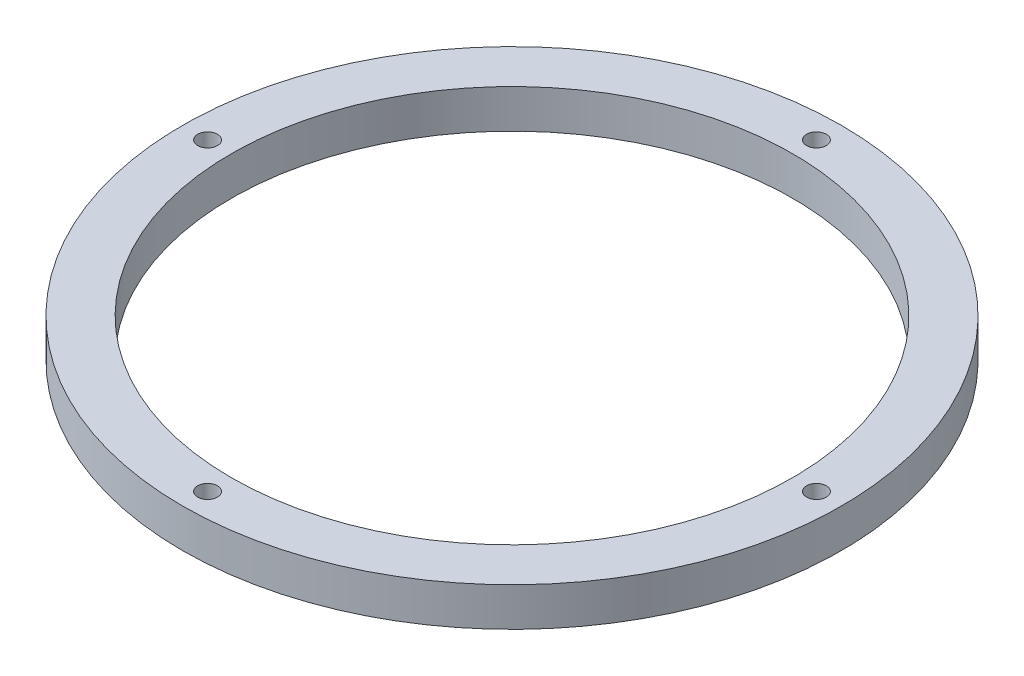
ISO-10303-21;
HEADER;
FILE_DESCRIPTION(('STEP AP214'),'2;1');
FILE_NAME('part.step','',(''),(''),'','','');
FILE_SCHEMA(('AUTOMOTIVE_DESIGN { 1 0 10303 214 1 1 1 1 }'));
ENDSEC;
DATA;
#1=APPLICATION_CONTEXT('core data for automotive mechanical design processes');
#2=APPLICATION_PROTOCOL_DEFINITION('international standard','automotive_design',2000,#1);
#3=PRODUCT_CONTEXT('',#1,'mechanical');
#4=PRODUCT('Part','Part','',(#3));
#5=PRODUCT_RELATED_PRODUCT_CATEGORY('part','',(#4));
#6=PRODUCT_DEFINITION_FORMATION('','',#4);
#7=PRODUCT_DEFINITION_CONTEXT('part definition',#1,'design');
#8=PRODUCT_DEFINITION('design','',#6,#7);
#9=PRODUCT_DEFINITION_SHAPE('','',#8);
#10=(LENGTH_UNIT() NAMED_UNIT(*) SI_UNIT(.MILLI.,.METRE.));
#11=(NAMED_UNIT(*) PLANE_ANGLE_UNIT() SI_UNIT($,.RADIAN.));
#12=(NAMED_UNIT(*) SI_UNIT($,.STERADIAN.) SOLID_ANGLE_UNIT());
#13=UNCERTAINTY_MEASURE_WITH_UNIT(LENGTH_MEASURE(1.E-05),#10,'distance_accuracy_value','');
#14=(GEOMETRIC_REPRESENTATION_CONTEXT(3) GLOBAL_UNCERTAINTY_ASSIGNED_CONTEXT((#13)) GLOBAL_UNIT_ASSIGNED_CONTEXT((#10,
#11,#12)) REPRESENTATION_CONTEXT('',''));
#15=CARTESIAN_POINT('',(0.,0.,0.));
#16=DIRECTION('',(0.,0.,1.));
#17=DIRECTION('',(1.,0.,0.));
#18=AXIS2_PLACEMENT_3D('',#15,#16,#17);
#19=CARTESIAN_POINT('',(0.,-5.000000033,0.));
#20=DIRECTION('',(0.,1.,0.));
#21=DIRECTION('',(0.,0.,1.));
#22=AXIS2_PLACEMENT_3D('',#19,#20,#21);
#23=PLANE('',#22);
#24=CARTESIAN_POINT('',(78.74999998,-5.000000033,0.));
#25=DIRECTION('',(0.,-1.,0.));
#26=DIRECTION('',(0.,0.,-1.));
#27=AXIS2_PLACEMENT_3D('',#24,#25,#26);
#28=CIRCLE('',#27,4.88950000000001);
#29=CARTESIAN_POINT('',(78.74999998,-5.000000033,-4.88950000000001));
#30=VERTEX_POINT('',#29);
#31=EDGE_CURVE('E81',#30,#30,#28,.T.);
#32=ORIENTED_EDGE('',*,*,#31,.F.);
#33=EDGE_LOOP('',(#32));
#34=FACE_BOUND('',#33,.T.);
#35=CARTESIAN_POINT('',(2.74954155364067E-13,-5.000000033,-78.74999998));
#36=DIRECTION('',(0.,-1.,0.));
#37=DIRECTION('',(0.,0.,-1.));
#38=AXIS2_PLACEMENT_3D('',#35,#36,#37);
#39=CIRCLE('',#38,4.8895);
#40=CARTESIAN_POINT('',(2.74954155364067E-13,-5.000000033,-83.63949998));
#41=VERTEX_POINT('',#40);
#42=EDGE_CURVE('E72',#41,#41,#39,.T.);
#43=ORIENTED_EDGE('',*,*,#42,.F.);
#44=EDGE_LOOP('',(#43));
#45=FACE_BOUND('',#44,.T.);
#46=CARTESIAN_POINT('',(-78.74999998,-5.000000033,0.));
#47=DIRECTION('',(0.,-1.,0.));
#48=DIRECTION('',(0.,0.,-1.));
#49=AXIS2_PLACEMENT_3D('',#46,#47,#48);
#50=CIRCLE('',#49,4.88950000000001);
#51=CARTESIAN_POINT('',(-78.74999998,-5.000000033,-4.88950000000001));
#52=VERTEX_POINT('',#51);
#53=EDGE_CURVE('E63',#52,#52,#50,.T.);
#54=ORIENTED_EDGE('',*,*,#53,.F.);
#55=EDGE_LOOP('',(#54));
#56=FACE_BOUND('',#55,.T.);
#57=CARTESIAN_POINT('',(0.,-5.000000033,0.));
#58=DIRECTION('',(0.,1.,0.));
#59=DIRECTION('',(0.,0.,1.));
#60=AXIS2_PLACEMENT_3D('',#57,#58,#59);
#61=CIRCLE('',#60,72.599999961);
#62=CARTESIAN_POINT('',(0.,-5.000000033,72.599999961));
#63=VERTEX_POINT('',#62);
#64=EDGE_CURVE('E43',#63,#63,#61,.T.);
#65=ORIENTED_EDGE('',*,*,#64,.T.);
#66=EDGE_LOOP('',(#65));
#67=FACE_BOUND('',#66,.T.);
#68=CARTESIAN_POINT('',(0.,-5.000000033,0.));
#69=DIRECTION('',(0.,1.,0.));
#70=DIRECTION('',(0.,0.,1.));
#71=AXIS2_PLACEMENT_3D('',#68,#69,#70);
#72=CIRCLE('',#71,85.250000061);
#73=CARTESIAN_POINT('',(0.,-5.000000033,85.250000061));
#74=VERTEX_POINT('',#73);
#75=EDGE_CURVE('E34',#74,#74,#72,.T.);
#76=ORIENTED_EDGE('',*,*,#75,.F.);
#77=EDGE_LOOP('',(#76));
#78=FACE_BOUND('',#77,.T.);
#79=CARTESIAN_POINT('',(-8.24862466092201E-13,-5.000000033,78.74999998));
#80=DIRECTION('',(0.,-1.,0.));
#81=DIRECTION('',(0.,0.,-1.));
#82=AXIS2_PLACEMENT_3D('',#79,#80,#81);
#83=CIRCLE('',#82,4.8895);
#84=CARTESIAN_POINT('',(-8.24862466092201E-13,-5.000000033,73.86049998));
#85=VERTEX_POINT('',#84);
#86=EDGE_CURVE('E54',#85,#85,#83,.T.);
#87=ORIENTED_EDGE('',*,*,#86,.F.);
#88=EDGE_LOOP('',(#87));
#89=FACE_BOUND('',#88,.T.);
#90=ADVANCED_FACE('F30',(#34,#45,#56,#67,#78,#89),#23,.F.);
#91=CARTESIAN_POINT('',(0.,5.000000033,0.));
#92=DIRECTION('',(0.,1.,0.));
#93=DIRECTION('',(0.,0.,1.));
#94=AXIS2_PLACEMENT_3D('',#91,#92,#93);
#95=PLANE('',#94);
#96=CARTESIAN_POINT('',(78.74999998,5.000000033,0.));
#97=DIRECTION('',(0.,-1.,0.));
#98=DIRECTION('',(0.,0.,-1.));
#99=AXIS2_PLACEMENT_3D('',#96,#97,#98);
#100=CIRCLE('',#99,2.55270000000001);
#101=CARTESIAN_POINT('',(78.74999998,5.000000033,-2.55270000000001));
#102=VERTEX_POINT('',#101);
#103=EDGE_CURVE('E75',#102,#102,#100,.T.);
#104=ORIENTED_EDGE('',*,*,#103,.T.);
#105=EDGE_LOOP('',(#104));
#106=FACE_BOUND('',#105,.T.);
#107=CARTESIAN_POINT('',(2.74954155364067E-13,5.000000033,-78.74999998));
#108=DIRECTION('',(0.,-1.,0.));
#109=DIRECTION('',(0.,0.,-1.));
#110=AXIS2_PLACEMENT_3D('',#107,#108,#109);
#111=CIRCLE('',#110,2.5527);
#112=CARTESIAN_POINT('',(2.74954155364067E-13,5.000000033,-81.30269998));
#113=VERTEX_POINT('',#112);
#114=EDGE_CURVE('E66',#113,#113,#111,.T.);
#115=ORIENTED_EDGE('',*,*,#114,.T.);
#116=EDGE_LOOP('',(#115));
#117=FACE_BOUND('',#116,.T.);
#118=CARTESIAN_POINT('',(-78.74999998,5.000000033,0.));
#119=DIRECTION('',(0.,-1.,0.));
#120=DIRECTION('',(0.,0.,-1.));
#121=AXIS2_PLACEMENT_3D('',#118,#119,#120);
#122=CIRCLE('',#121,2.55270000000001);
#123=CARTESIAN_POINT('',(-78.74999998,5.000000033,-2.55270000000001));
#124=VERTEX_POINT('',#123);
#125=EDGE_CURVE('E57',#124,#124,#122,.T.);
#126=ORIENTED_EDGE('',*,*,#125,.T.);
#127=EDGE_LOOP('',(#126));
#128=FACE_BOUND('',#127,.T.);
#129=CARTESIAN_POINT('',(-8.24862466092201E-13,5.000000033,78.74999998));
#130=DIRECTION('',(0.,-1.,0.));
#131=DIRECTION('',(0.,0.,-1.));
#132=AXIS2_PLACEMENT_3D('',#129,#130,#131);
#133=CIRCLE('',#132,2.5527);
#134=CARTESIAN_POINT('',(-8.24862466092201E-13,5.000000033,76.19729998));
#135=VERTEX_POINT('',#134);
#136=EDGE_CURVE('E46',#135,#135,#133,.T.);
#137=ORIENTED_EDGE('',*,*,#136,.T.);
#138=EDGE_LOOP('',(#137));
#139=FACE_BOUND('',#138,.T.);
#140=CARTESIAN_POINT('',(0.,5.000000033,0.));
#141=DIRECTION('',(0.,1.,0.));
#142=DIRECTION('',(0.,0.,1.));
#143=AXIS2_PLACEMENT_3D('',#140,#141,#142);
#144=CIRCLE('',#143,85.250000061);
#145=CARTESIAN_POINT('',(0.,5.000000033,85.250000061));
#146=VERTEX_POINT('',#145);
#147=EDGE_CURVE('E10',#146,#146,#144,.T.);
#148=ORIENTED_EDGE('',*,*,#147,.T.);
#149=EDGE_LOOP('',(#148));
#150=FACE_BOUND('',#149,.T.);
#151=CARTESIAN_POINT('',(0.,5.000000033,0.));
#152=DIRECTION('',(0.,1.,0.));
#153=DIRECTION('',(0.,0.,1.));
#154=AXIS2_PLACEMENT_3D('',#151,#152,#153);
#155=CIRCLE('',#154,72.599999961);
#156=CARTESIAN_POINT('',(0.,5.000000033,72.599999961));
#157=VERTEX_POINT('',#156);
#158=EDGE_CURVE('E41',#157,#157,#155,.T.);
#159=ORIENTED_EDGE('',*,*,#158,.F.);
#160=EDGE_LOOP('',(#159));
#161=FACE_BOUND('',#160,.T.);
#162=ADVANCED_FACE('F89',(#106,#117,#128,#139,#150,#161),#95,.T.);
#163=CARTESIAN_POINT('',(0.,5.000000033,0.));
#164=DIRECTION('',(0.,-1.,0.));
#165=DIRECTION('',(0.,0.,-1.));
#166=AXIS2_PLACEMENT_3D('',#163,#164,#165);
#167=CYLINDRICAL_SURFACE('',#166,85.250000061);
#168=ORIENTED_EDGE('',*,*,#147,.F.);
#169=EDGE_LOOP('',(#168));
#170=FACE_BOUND('',#169,.T.);
#171=ORIENTED_EDGE('',*,*,#75,.T.);
#172=EDGE_LOOP('',(#171));
#173=FACE_BOUND('',#172,.T.);
#174=ADVANCED_FACE('F32',(#170,#173),#167,.T.);
#175=CARTESIAN_POINT('',(0.,5.000000033,0.));
#176=DIRECTION('',(0.,-1.,0.));
#177=DIRECTION('',(0.,0.,-1.));
#178=AXIS2_PLACEMENT_3D('',#175,#176,#177);
#179=CYLINDRICAL_SURFACE('',#178,72.599999961);
#180=ORIENTED_EDGE('',*,*,#158,.T.);
#181=EDGE_LOOP('',(#180));
#182=FACE_BOUND('',#181,.T.);
#183=ORIENTED_EDGE('',*,*,#64,.F.);
#184=EDGE_LOOP('',(#183));
#185=FACE_BOUND('',#184,.T.);
#186=ADVANCED_FACE('F113',(#182,#185),#179,.F.);
#187=CARTESIAN_POINT('',(-8.24862466092201E-13,-5.000000033,78.74999998));
#188=DIRECTION('',(0.,-1.,0.));
#189=DIRECTION('',(0.,0.,-1.));
#190=AXIS2_PLACEMENT_3D('',#187,#188,#189);
#191=CYLINDRICAL_SURFACE('',#190,2.5527);
#192=ORIENTED_EDGE('',*,*,#136,.F.);
#193=EDGE_LOOP('',(#192));
#194=FACE_BOUND('',#193,.T.);
#195=CARTESIAN_POINT('',(-8.24862466092201E-13,-3.03919201486493,78.74999998));
#196=DIRECTION('',(0.,-1.,0.));
#197=DIRECTION('',(0.,0.,-1.));
#198=AXIS2_PLACEMENT_3D('',#195,#196,#197);
#199=CIRCLE('',#198,2.5527);
#200=CARTESIAN_POINT('',(-8.24862466092201E-13,-3.03919201486493,76.19729998));
#201=VERTEX_POINT('',#200);
#202=EDGE_CURVE('E51',#201,#201,#199,.T.);
#203=ORIENTED_EDGE('',*,*,#202,.T.);
#204=EDGE_LOOP('',(#203));
#205=FACE_BOUND('',#204,.T.);
#206=ADVANCED_FACE('F103',(#194,#205),#191,.F.);
#207=CARTESIAN_POINT('',(-8.24862466092201E-13,-5.000000033,78.74999998));
#208=DIRECTION('',(0.,-1.,0.));
#209=DIRECTION('',(0.,0.,-1.));
#210=AXIS2_PLACEMENT_3D('',#207,#208,#209);
#211=CONICAL_SURFACE('',#210,4.8895,0.872664625997164);
#212=ORIENTED_EDGE('',*,*,#202,.F.);
#213=EDGE_LOOP('',(#212));
#214=FACE_BOUND('',#213,.T.);
#215=ORIENTED_EDGE('',*,*,#86,.T.);
#216=EDGE_LOOP('',(#215));
#217=FACE_BOUND('',#216,.T.);
#218=ADVANCED_FACE('F100',(#214,#217),#211,.F.);
#219=CARTESIAN_POINT('',(-78.74999998,-5.000000033,0.));
#220=DIRECTION('',(0.,-1.,0.));
#221=DIRECTION('',(0.,0.,-1.));
#222=AXIS2_PLACEMENT_3D('',#219,#220,#221);
#223=CYLINDRICAL_SURFACE('',#222,2.55270000000001);
#224=ORIENTED_EDGE('',*,*,#125,.F.);
#225=EDGE_LOOP('',(#224));
#226=FACE_BOUND('',#225,.T.);
#227=CARTESIAN_POINT('',(-78.74999998,-3.03919201486493,0.));
#228=DIRECTION('',(0.,-1.,0.));
#229=DIRECTION('',(0.,0.,-1.));
#230=AXIS2_PLACEMENT_3D('',#227,#228,#229);
#231=CIRCLE('',#230,2.55270000000001);
#232=CARTESIAN_POINT('',(-78.74999998,-3.03919201486493,-2.55270000000001));
#233=VERTEX_POINT('',#232);
#234=EDGE_CURVE('E60',#233,#233,#231,.T.);
#235=ORIENTED_EDGE('',*,*,#234,.T.);
#236=EDGE_LOOP('',(#235));
#237=FACE_BOUND('',#236,.T.);
#238=ADVANCED_FACE('F102',(#226,#237),#223,.F.);
#239=CARTESIAN_POINT('',(-78.74999998,-5.000000033,0.));
#240=DIRECTION('',(0.,-1.,0.));
#241=DIRECTION('',(0.,0.,-1.));
#242=AXIS2_PLACEMENT_3D('',#239,#240,#241);
#243=CONICAL_SURFACE('',#242,4.88950000000001,0.872664625997164);
#244=ORIENTED_EDGE('',*,*,#234,.F.);
#245=EDGE_LOOP('',(#244));
#246=FACE_BOUND('',#245,.T.);
#247=ORIENTED_EDGE('',*,*,#53,.T.);
#248=EDGE_LOOP('',(#247));
#249=FACE_BOUND('',#248,.T.);
#250=ADVANCED_FACE('F110',(#246,#249),#243,.F.);
#251=CARTESIAN_POINT('',(2.74954155364067E-13,-5.000000033,-78.74999998));
#252=DIRECTION('',(0.,-1.,0.));
#253=DIRECTION('',(0.,0.,-1.));
#254=AXIS2_PLACEMENT_3D('',#251,#252,#253);
#255=CYLINDRICAL_SURFACE('',#254,2.5527);
#256=ORIENTED_EDGE('',*,*,#114,.F.);
#257=EDGE_LOOP('',(#256));
#258=FACE_BOUND('',#257,.T.);
#259=CARTESIAN_POINT('',(2.74954155364067E-13,-3.03919201486493,-78.74999998));
#260=DIRECTION('',(0.,-1.,0.));
#261=DIRECTION('',(0.,0.,-1.));
#262=AXIS2_PLACEMENT_3D('',#259,#260,#261);
#263=CIRCLE('',#262,2.5527);
#264=CARTESIAN_POINT('',(2.74954155364067E-13,-3.03919201486493,-81.30269998));
#265=VERTEX_POINT('',#264);
#266=EDGE_CURVE('E69',#265,#265,#263,.T.);
#267=ORIENTED_EDGE('',*,*,#266,.T.);
#268=EDGE_LOOP('',(#267));
#269=FACE_BOUND('',#268,.T.);
#270=ADVANCED_FACE('F144',(#258,#269),#255,.F.);
#271=CARTESIAN_POINT('',(2.74954155364067E-13,-5.000000033,-78.74999998));
#272=DIRECTION('',(0.,-1.,0.));
#273=DIRECTION('',(0.,0.,-1.));
#274=AXIS2_PLACEMENT_3D('',#271,#272,#273);
#275=CONICAL_SURFACE('',#274,4.8895,0.872664625997164);
#276=ORIENTED_EDGE('',*,*,#266,.F.);
#277=EDGE_LOOP('',(#276));
#278=FACE_BOUND('',#277,.T.);
#279=ORIENTED_EDGE('',*,*,#42,.T.);
#280=EDGE_LOOP('',(#279));
#281=FACE_BOUND('',#280,.T.);
#282=ADVANCED_FACE('F148',(#278,#281),#275,.F.);
#283=CARTESIAN_POINT('',(78.74999998,-5.000000033,0.));
#284=DIRECTION('',(0.,-1.,0.));
#285=DIRECTION('',(0.,0.,-1.));
#286=AXIS2_PLACEMENT_3D('',#283,#284,#285);
#287=CYLINDRICAL_SURFACE('',#286,2.55270000000001);
#288=ORIENTED_EDGE('',*,*,#103,.F.);
#289=EDGE_LOOP('',(#288));
#290=FACE_BOUND('',#289,.T.);
#291=CARTESIAN_POINT('',(78.74999998,-3.03919201486493,0.));
#292=DIRECTION('',(0.,-1.,0.));
#293=DIRECTION('',(0.,0.,-1.));
#294=AXIS2_PLACEMENT_3D('',#291,#292,#293);
#295=CIRCLE('',#294,2.55270000000001);
#296=CARTESIAN_POINT('',(78.74999998,-3.03919201486493,-2.55270000000001));
#297=VERTEX_POINT('',#296);
#298=EDGE_CURVE('E78',#297,#297,#295,.T.);
#299=ORIENTED_EDGE('',*,*,#298,.T.);
#300=EDGE_LOOP('',(#299));
#301=FACE_BOUND('',#300,.T.);
#302=ADVANCED_FACE('F154',(#290,#301),#287,.F.);
#303=CARTESIAN_POINT('',(78.74999998,-5.000000033,0.));
#304=DIRECTION('',(0.,-1.,0.));
#305=DIRECTION('',(0.,0.,-1.));
#306=AXIS2_PLACEMENT_3D('',#303,#304,#305);
#307=CONICAL_SURFACE('',#306,4.88950000000001,0.872664625997164);
#308=ORIENTED_EDGE('',*,*,#298,.F.);
#309=EDGE_LOOP('',(#308));
#310=FACE_BOUND('',#309,.T.);
#311=ORIENTED_EDGE('',*,*,#31,.T.);
#312=EDGE_LOOP('',(#311));
#313=FACE_BOUND('',#312,.T.);
#314=ADVANCED_FACE('F85',(#310,#313),#307,.F.);
#315=CLOSED_SHELL('',(#90,#162,#174,#186,#206,#218,#238,#250,#270,#282,#302,#314));
#316=MANIFOLD_SOLID_BREP('B2',#315);
#317=ADVANCED_BREP_SHAPE_REPRESENTATION('',(#18,#316),#14);
#318=SHAPE_DEFINITION_REPRESENTATION(#9,#317);
ENDSEC;
END-ISO-10303-21;
